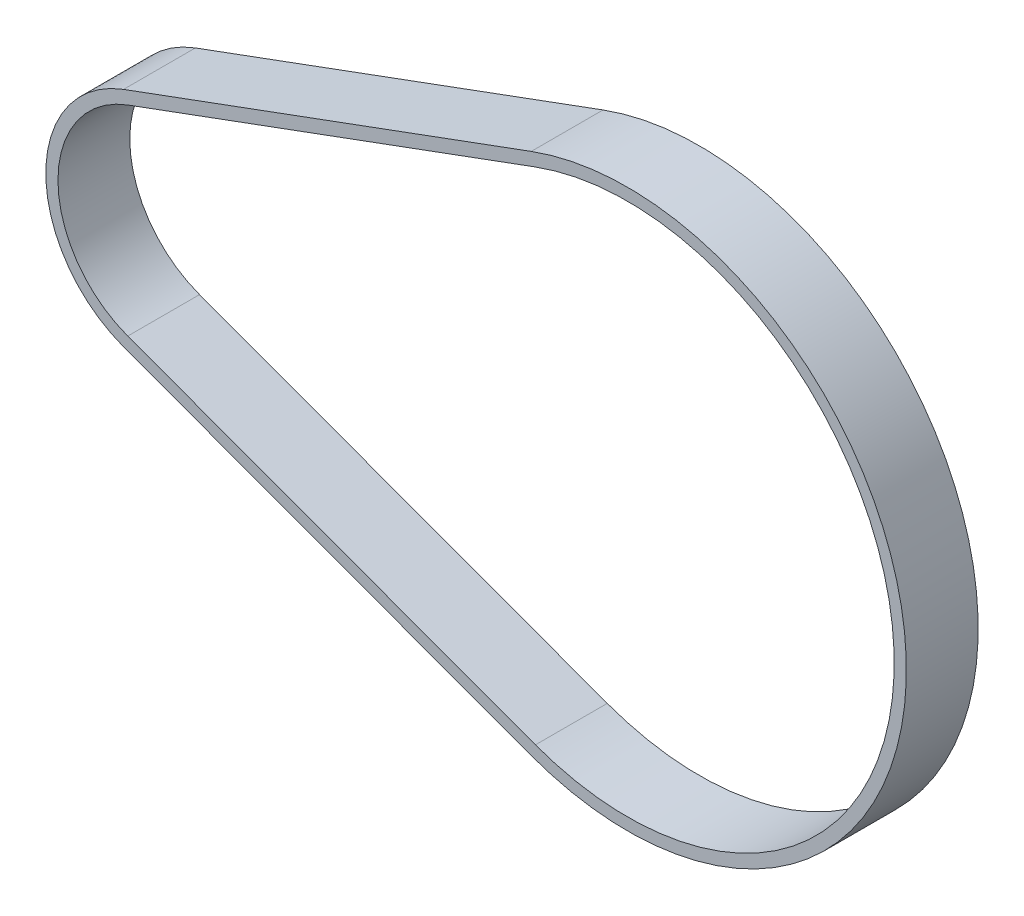
ISO-10303-21;
HEADER;
FILE_DESCRIPTION(('STEP AP214'),'2;1');
FILE_NAME('part.step','',(''),(''),'','','');
FILE_SCHEMA(('AUTOMOTIVE_DESIGN { 1 0 10303 214 1 1 1 1 }'));
ENDSEC;
DATA;
#1=APPLICATION_CONTEXT('core data for automotive mechanical design processes');
#2=APPLICATION_PROTOCOL_DEFINITION('international standard','automotive_design',2000,#1);
#3=PRODUCT_CONTEXT('',#1,'mechanical');
#4=PRODUCT('Part','Part','',(#3));
#5=PRODUCT_RELATED_PRODUCT_CATEGORY('part','',(#4));
#6=PRODUCT_DEFINITION_FORMATION('','',#4);
#7=PRODUCT_DEFINITION_CONTEXT('part definition',#1,'design');
#8=PRODUCT_DEFINITION('design','',#6,#7);
#9=PRODUCT_DEFINITION_SHAPE('','',#8);
#10=(LENGTH_UNIT() NAMED_UNIT(*) SI_UNIT(.MILLI.,.METRE.));
#11=(NAMED_UNIT(*) PLANE_ANGLE_UNIT() SI_UNIT($,.RADIAN.));
#12=(NAMED_UNIT(*) SI_UNIT($,.STERADIAN.) SOLID_ANGLE_UNIT());
#13=UNCERTAINTY_MEASURE_WITH_UNIT(LENGTH_MEASURE(1.E-05),#10,'distance_accuracy_value','');
#14=(GEOMETRIC_REPRESENTATION_CONTEXT(3) GLOBAL_UNCERTAINTY_ASSIGNED_CONTEXT((#13)) GLOBAL_UNIT_ASSIGNED_CONTEXT((#10,
#11,#12)) REPRESENTATION_CONTEXT('',''));
#15=CARTESIAN_POINT('',(0.,0.,0.));
#16=DIRECTION('',(0.,0.,1.));
#17=DIRECTION('',(1.,0.,0.));
#18=AXIS2_PLACEMENT_3D('',#15,#16,#17);
#19=CARTESIAN_POINT('',(96.7232,0.,15.));
#20=DIRECTION('',(0.,0.,1.));
#21=DIRECTION('',(1.,0.,0.));
#22=AXIS2_PLACEMENT_3D('',#19,#20,#21);
#23=PLANE('',#22);
#24=CARTESIAN_POINT('',(96.7232,0.,15.));
#25=DIRECTION('',(0.,0.,1.));
#26=DIRECTION('',(1.,0.,0.));
#27=AXIS2_PLACEMENT_3D('',#24,#25,#26);
#28=CIRCLE('',#27,58.2422);
#29=CARTESIAN_POINT('',(76.5953808823529,-54.6536801908827,15.));
#30=VERTEX_POINT('',#29);
#31=CARTESIAN_POINT('',(76.5953808823529,54.6536801908827,15.));
#32=VERTEX_POINT('',#31);
#33=EDGE_CURVE('E140',#30,#32,#28,.T.);
#34=ORIENTED_EDGE('',*,*,#33,.T.);
#35=DIRECTION('',(-0.938386259291075,-0.345588235294118,0.));
#36=VECTOR('',#35,1.);
#37=CARTESIAN_POINT('',(-8.57604852941177,23.2868057333155,15.));
#38=LINE('',#37,#36);
#39=CARTESIAN_POINT('',(-8.57604852941177,23.2868057333155,15.));
#40=VERTEX_POINT('',#39);
#41=EDGE_CURVE('E143',#32,#40,#38,.T.);
#42=ORIENTED_EDGE('',*,*,#41,.T.);
#43=CARTESIAN_POINT('',(0.,0.,15.));
#44=DIRECTION('',(0.,0.,1.));
#45=DIRECTION('',(1.,0.,0.));
#46=AXIS2_PLACEMENT_3D('',#43,#44,#45);
#47=CIRCLE('',#46,24.8158);
#48=CARTESIAN_POINT('',(-8.57604852941178,-23.2868057333155,15.));
#49=VERTEX_POINT('',#48);
#50=EDGE_CURVE('E146',#40,#49,#47,.T.);
#51=ORIENTED_EDGE('',*,*,#50,.T.);
#52=DIRECTION('',(0.938386259291075,-0.345588235294118,0.));
#53=VECTOR('',#52,1.);
#54=CARTESIAN_POINT('',(76.5953808823529,-54.6536801908827,15.));
#55=LINE('',#54,#53);
#56=EDGE_CURVE('E148',#49,#30,#55,.T.);
#57=ORIENTED_EDGE('',*,*,#56,.T.);
#58=EDGE_LOOP('',(#34,#42,#51,#57));
#59=FACE_BOUND('',#58,.T.);
#60=DIRECTION('',(0.938386259291075,-0.345588235294118,0.));
#61=VECTOR('',#60,1.);
#62=CARTESIAN_POINT('',(77.473175,-52.2701790922833,15.));
#63=LINE('',#62,#61);
#64=CARTESIAN_POINT('',(-7.69825441176471,-20.9033046347161,15.));
#65=VERTEX_POINT('',#64);
#66=CARTESIAN_POINT('',(77.473175,-52.2701790922833,15.));
#67=VERTEX_POINT('',#66);
#68=EDGE_CURVE('E112',#65,#67,#63,.T.);
#69=ORIENTED_EDGE('',*,*,#68,.F.);
#70=CARTESIAN_POINT('',(0.,0.,15.));
#71=DIRECTION('',(0.,0.,1.));
#72=DIRECTION('',(1.,0.,0.));
#73=AXIS2_PLACEMENT_3D('',#70,#71,#72);
#74=CIRCLE('',#73,22.2758);
#75=CARTESIAN_POINT('',(-7.69825441176471,20.9033046347161,15.));
#76=VERTEX_POINT('',#75);
#77=EDGE_CURVE('E104',#76,#65,#74,.T.);
#78=ORIENTED_EDGE('',*,*,#77,.F.);
#79=DIRECTION('',(-0.938386259291075,-0.345588235294118,0.));
#80=VECTOR('',#79,1.);
#81=CARTESIAN_POINT('',(-7.69825441176471,20.9033046347161,15.));
#82=LINE('',#81,#80);
#83=CARTESIAN_POINT('',(77.473175,52.2701790922834,15.));
#84=VERTEX_POINT('',#83);
#85=EDGE_CURVE('E126',#84,#76,#82,.T.);
#86=ORIENTED_EDGE('',*,*,#85,.F.);
#87=CARTESIAN_POINT('',(96.7232,0.,15.));
#88=DIRECTION('',(0.,0.,1.));
#89=DIRECTION('',(1.,0.,0.));
#90=AXIS2_PLACEMENT_3D('',#87,#88,#89);
#91=CIRCLE('',#90,55.7022);
#92=EDGE_CURVE('E124',#67,#84,#91,.T.);
#93=ORIENTED_EDGE('',*,*,#92,.F.);
#94=EDGE_LOOP('',(#69,#78,#86,#93));
#95=FACE_BOUND('',#94,.T.);
#96=ADVANCED_FACE('F39',(#59,#95),#23,.T.);
#97=CARTESIAN_POINT('',(96.7232,0.,0.));
#98=DIRECTION('',(0.,0.,1.));
#99=DIRECTION('',(1.,0.,0.));
#100=AXIS2_PLACEMENT_3D('',#97,#98,#99);
#101=PLANE('',#100);
#102=CARTESIAN_POINT('',(96.7232,0.,0.));
#103=DIRECTION('',(0.,0.,1.));
#104=DIRECTION('',(1.,0.,0.));
#105=AXIS2_PLACEMENT_3D('',#102,#103,#104);
#106=CIRCLE('',#105,58.2422);
#107=CARTESIAN_POINT('',(76.5953808823529,-54.6536801908827,0.));
#108=VERTEX_POINT('',#107);
#109=CARTESIAN_POINT('',(76.5953808823529,54.6536801908827,0.));
#110=VERTEX_POINT('',#109);
#111=EDGE_CURVE('E120',#108,#110,#106,.T.);
#112=ORIENTED_EDGE('',*,*,#111,.F.);
#113=DIRECTION('',(0.938386259291075,-0.345588235294118,0.));
#114=VECTOR('',#113,1.);
#115=CARTESIAN_POINT('',(76.5953808823529,-54.6536801908827,0.));
#116=LINE('',#115,#114);
#117=CARTESIAN_POINT('',(-8.57604852941178,-23.2868057333155,0.));
#118=VERTEX_POINT('',#117);
#119=EDGE_CURVE('E144',#118,#108,#116,.T.);
#120=ORIENTED_EDGE('',*,*,#119,.F.);
#121=CARTESIAN_POINT('',(0.,0.,0.));
#122=DIRECTION('',(0.,0.,1.));
#123=DIRECTION('',(1.,0.,0.));
#124=AXIS2_PLACEMENT_3D('',#121,#122,#123);
#125=CIRCLE('',#124,24.8158);
#126=CARTESIAN_POINT('',(-8.57604852941177,23.2868057333155,0.));
#127=VERTEX_POINT('',#126);
#128=EDGE_CURVE('E155',#127,#118,#125,.T.);
#129=ORIENTED_EDGE('',*,*,#128,.F.);
#130=DIRECTION('',(-0.938386259291075,-0.345588235294118,0.));
#131=VECTOR('',#130,1.);
#132=CARTESIAN_POINT('',(-8.57604852941177,23.2868057333155,0.));
#133=LINE('',#132,#131);
#134=EDGE_CURVE('E153',#110,#127,#133,.T.);
#135=ORIENTED_EDGE('',*,*,#134,.F.);
#136=EDGE_LOOP('',(#112,#120,#129,#135));
#137=FACE_BOUND('',#136,.T.);
#138=CARTESIAN_POINT('',(0.,0.,0.));
#139=DIRECTION('',(0.,0.,1.));
#140=DIRECTION('',(1.,0.,0.));
#141=AXIS2_PLACEMENT_3D('',#138,#139,#140);
#142=CIRCLE('',#141,22.2758);
#143=CARTESIAN_POINT('',(-7.69825441176472,20.9033046347161,0.));
#144=VERTEX_POINT('',#143);
#145=CARTESIAN_POINT('',(-7.69825441176471,-20.9033046347161,0.));
#146=VERTEX_POINT('',#145);
#147=EDGE_CURVE('E62',#144,#146,#142,.T.);
#148=ORIENTED_EDGE('',*,*,#147,.T.);
#149=DIRECTION('',(0.938386259291075,-0.345588235294118,0.));
#150=VECTOR('',#149,1.);
#151=CARTESIAN_POINT('',(77.473175,-52.2701790922833,0.));
#152=LINE('',#151,#150);
#153=CARTESIAN_POINT('',(77.473175,-52.2701790922833,0.));
#154=VERTEX_POINT('',#153);
#155=EDGE_CURVE('E119',#146,#154,#152,.T.);
#156=ORIENTED_EDGE('',*,*,#155,.T.);
#157=CARTESIAN_POINT('',(96.7232,0.,0.));
#158=DIRECTION('',(0.,0.,1.));
#159=DIRECTION('',(1.,0.,0.));
#160=AXIS2_PLACEMENT_3D('',#157,#158,#159);
#161=CIRCLE('',#160,55.7022);
#162=CARTESIAN_POINT('',(77.473175,52.2701790922834,0.));
#163=VERTEX_POINT('',#162);
#164=EDGE_CURVE('E132',#154,#163,#161,.T.);
#165=ORIENTED_EDGE('',*,*,#164,.T.);
#166=DIRECTION('',(-0.938386259291075,-0.345588235294118,0.));
#167=VECTOR('',#166,1.);
#168=CARTESIAN_POINT('',(-7.69825441176471,20.9033046347161,0.));
#169=LINE('',#168,#167);
#170=EDGE_CURVE('E113',#163,#144,#169,.T.);
#171=ORIENTED_EDGE('',*,*,#170,.T.);
#172=EDGE_LOOP('',(#148,#156,#165,#171));
#173=FACE_BOUND('',#172,.T.);
#174=ADVANCED_FACE('F173',(#137,#173),#101,.F.);
#175=CARTESIAN_POINT('',(96.7232,0.,15.));
#176=DIRECTION('',(0.,0.,-1.));
#177=DIRECTION('',(-1.,0.,0.));
#178=AXIS2_PLACEMENT_3D('',#175,#176,#177);
#179=CYLINDRICAL_SURFACE('',#178,58.2422);
#180=ORIENTED_EDGE('',*,*,#111,.T.);
#181=DIRECTION('',(0.,0.,-1.));
#182=VECTOR('',#181,1.);
#183=CARTESIAN_POINT('',(76.5953808823529,54.6536801908827,15.));
#184=LINE('',#183,#182);
#185=EDGE_CURVE('E11',#32,#110,#184,.T.);
#186=ORIENTED_EDGE('',*,*,#185,.F.);
#187=ORIENTED_EDGE('',*,*,#33,.F.);
#188=DIRECTION('',(0.,0.,-1.));
#189=VECTOR('',#188,1.);
#190=CARTESIAN_POINT('',(76.5953808823529,-54.6536801908827,15.));
#191=LINE('',#190,#189);
#192=EDGE_CURVE('E150',#30,#108,#191,.T.);
#193=ORIENTED_EDGE('',*,*,#192,.T.);
#194=EDGE_LOOP('',(#180,#186,#187,#193));
#195=FACE_BOUND('',#194,.T.);
#196=ADVANCED_FACE('F41',(#195),#179,.T.);
#197=CARTESIAN_POINT('',(-8.57604852941177,23.2868057333155,15.));
#198=DIRECTION('',(0.345588235294118,-0.938386259291075,0.));
#199=DIRECTION('',(0.938386259291076,0.345588235294118,0.));
#200=AXIS2_PLACEMENT_3D('',#197,#198,#199);
#201=PLANE('',#200);
#202=ORIENTED_EDGE('',*,*,#134,.T.);
#203=DIRECTION('',(0.,0.,-1.));
#204=VECTOR('',#203,1.);
#205=CARTESIAN_POINT('',(-8.57604852941177,23.2868057333155,15.));
#206=LINE('',#205,#204);
#207=EDGE_CURVE('E47',#40,#127,#206,.T.);
#208=ORIENTED_EDGE('',*,*,#207,.F.);
#209=ORIENTED_EDGE('',*,*,#41,.F.);
#210=ORIENTED_EDGE('',*,*,#185,.T.);
#211=EDGE_LOOP('',(#202,#208,#209,#210));
#212=FACE_BOUND('',#211,.T.);
#213=ADVANCED_FACE('F183',(#212),#201,.F.);
#214=CARTESIAN_POINT('',(0.,0.,15.));
#215=DIRECTION('',(0.,0.,-1.));
#216=DIRECTION('',(-1.,0.,0.));
#217=AXIS2_PLACEMENT_3D('',#214,#215,#216);
#218=CYLINDRICAL_SURFACE('',#217,24.8158);
#219=ORIENTED_EDGE('',*,*,#128,.T.);
#220=DIRECTION('',(0.,0.,-1.));
#221=VECTOR('',#220,1.);
#222=CARTESIAN_POINT('',(-8.57604852941178,-23.2868057333155,15.));
#223=LINE('',#222,#221);
#224=EDGE_CURVE('E160',#49,#118,#223,.T.);
#225=ORIENTED_EDGE('',*,*,#224,.F.);
#226=ORIENTED_EDGE('',*,*,#50,.F.);
#227=ORIENTED_EDGE('',*,*,#207,.T.);
#228=EDGE_LOOP('',(#219,#225,#226,#227));
#229=FACE_BOUND('',#228,.T.);
#230=ADVANCED_FACE('F167',(#229),#218,.T.);
#231=CARTESIAN_POINT('',(76.5953808823529,-54.6536801908827,15.));
#232=DIRECTION('',(0.345588235294118,0.938386259291075,0.));
#233=DIRECTION('',(-0.938386259291076,0.345588235294118,0.));
#234=AXIS2_PLACEMENT_3D('',#231,#232,#233);
#235=PLANE('',#234);
#236=ORIENTED_EDGE('',*,*,#119,.T.);
#237=ORIENTED_EDGE('',*,*,#192,.F.);
#238=ORIENTED_EDGE('',*,*,#56,.F.);
#239=ORIENTED_EDGE('',*,*,#224,.T.);
#240=EDGE_LOOP('',(#236,#237,#238,#239));
#241=FACE_BOUND('',#240,.T.);
#242=ADVANCED_FACE('F177',(#241),#235,.F.);
#243=CARTESIAN_POINT('',(0.,0.,15.));
#244=DIRECTION('',(0.,0.,-1.));
#245=DIRECTION('',(-1.,0.,0.));
#246=AXIS2_PLACEMENT_3D('',#243,#244,#245);
#247=CYLINDRICAL_SURFACE('',#246,22.2758);
#248=ORIENTED_EDGE('',*,*,#147,.F.);
#249=DIRECTION('',(0.,0.,-1.));
#250=VECTOR('',#249,1.);
#251=CARTESIAN_POINT('',(-7.69825441176471,20.9033046347161,15.));
#252=LINE('',#251,#250);
#253=EDGE_CURVE('E108',#76,#144,#252,.T.);
#254=ORIENTED_EDGE('',*,*,#253,.F.);
#255=ORIENTED_EDGE('',*,*,#77,.T.);
#256=DIRECTION('',(0.,0.,-1.));
#257=VECTOR('',#256,1.);
#258=CARTESIAN_POINT('',(-7.69825441176471,-20.9033046347161,15.));
#259=LINE('',#258,#257);
#260=EDGE_CURVE('E107',#65,#146,#259,.T.);
#261=ORIENTED_EDGE('',*,*,#260,.T.);
#262=EDGE_LOOP('',(#248,#254,#255,#261));
#263=FACE_BOUND('',#262,.T.);
#264=ADVANCED_FACE('F106',(#263),#247,.F.);
#265=CARTESIAN_POINT('',(77.473175,-52.2701790922833,15.));
#266=DIRECTION('',(0.345588235294118,0.938386259291075,0.));
#267=DIRECTION('',(-0.938386259291076,0.345588235294118,0.));
#268=AXIS2_PLACEMENT_3D('',#265,#266,#267);
#269=PLANE('',#268);
#270=ORIENTED_EDGE('',*,*,#155,.F.);
#271=ORIENTED_EDGE('',*,*,#260,.F.);
#272=ORIENTED_EDGE('',*,*,#68,.T.);
#273=DIRECTION('',(0.,0.,-1.));
#274=VECTOR('',#273,1.);
#275=CARTESIAN_POINT('',(77.473175,-52.2701790922833,15.));
#276=LINE('',#275,#274);
#277=EDGE_CURVE('E121',#67,#154,#276,.T.);
#278=ORIENTED_EDGE('',*,*,#277,.T.);
#279=EDGE_LOOP('',(#270,#271,#272,#278));
#280=FACE_BOUND('',#279,.T.);
#281=ADVANCED_FACE('F116',(#280),#269,.T.);
#282=CARTESIAN_POINT('',(96.7232,0.,15.));
#283=DIRECTION('',(0.,0.,-1.));
#284=DIRECTION('',(-1.,0.,0.));
#285=AXIS2_PLACEMENT_3D('',#282,#283,#284);
#286=CYLINDRICAL_SURFACE('',#285,55.7022);
#287=ORIENTED_EDGE('',*,*,#164,.F.);
#288=ORIENTED_EDGE('',*,*,#277,.F.);
#289=ORIENTED_EDGE('',*,*,#92,.T.);
#290=DIRECTION('',(0.,0.,-1.));
#291=VECTOR('',#290,1.);
#292=CARTESIAN_POINT('',(77.473175,52.2701790922834,15.));
#293=LINE('',#292,#291);
#294=EDGE_CURVE('E54',#84,#163,#293,.T.);
#295=ORIENTED_EDGE('',*,*,#294,.T.);
#296=EDGE_LOOP('',(#287,#288,#289,#295));
#297=FACE_BOUND('',#296,.T.);
#298=ADVANCED_FACE('F206',(#297),#286,.F.);
#299=CARTESIAN_POINT('',(-7.69825441176471,20.9033046347161,15.));
#300=DIRECTION('',(0.345588235294118,-0.938386259291075,0.));
#301=DIRECTION('',(0.938386259291076,0.345588235294118,0.));
#302=AXIS2_PLACEMENT_3D('',#299,#300,#301);
#303=PLANE('',#302);
#304=ORIENTED_EDGE('',*,*,#170,.F.);
#305=ORIENTED_EDGE('',*,*,#294,.F.);
#306=ORIENTED_EDGE('',*,*,#85,.T.);
#307=ORIENTED_EDGE('',*,*,#253,.T.);
#308=EDGE_LOOP('',(#304,#305,#306,#307));
#309=FACE_BOUND('',#308,.T.);
#310=ADVANCED_FACE('F210',(#309),#303,.T.);
#311=CLOSED_SHELL('',(#96,#174,#196,#213,#230,#242,#264,#281,#298,#310));
#312=MANIFOLD_SOLID_BREP('B2',#311);
#313=ADVANCED_BREP_SHAPE_REPRESENTATION('',(#18,#312),#14);
#314=SHAPE_DEFINITION_REPRESENTATION(#9,#313);
ENDSEC;
END-ISO-10303-21;
